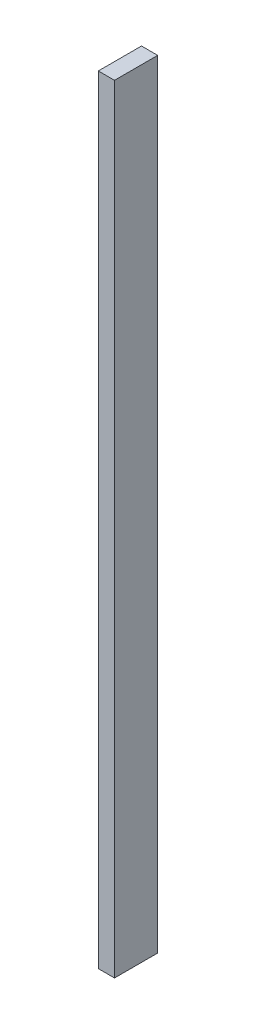
ISO-10303-21;
HEADER;
FILE_DESCRIPTION(('STEP AP214'),'2;1');
FILE_NAME('part.step','',(''),(''),'','','');
FILE_SCHEMA(('AUTOMOTIVE_DESIGN { 1 0 10303 214 1 1 1 1 }'));
ENDSEC;
DATA;
#1=APPLICATION_CONTEXT('core data for automotive mechanical design processes');
#2=APPLICATION_PROTOCOL_DEFINITION('international standard','automotive_design',2000,#1);
#3=PRODUCT_CONTEXT('',#1,'mechanical');
#4=PRODUCT('Part','Part','',(#3));
#5=PRODUCT_RELATED_PRODUCT_CATEGORY('part','',(#4));
#6=PRODUCT_DEFINITION_FORMATION('','',#4);
#7=PRODUCT_DEFINITION_CONTEXT('part definition',#1,'design');
#8=PRODUCT_DEFINITION('design','',#6,#7);
#9=PRODUCT_DEFINITION_SHAPE('','',#8);
#10=(LENGTH_UNIT() NAMED_UNIT(*) SI_UNIT(.MILLI.,.METRE.));
#11=(NAMED_UNIT(*) PLANE_ANGLE_UNIT() SI_UNIT($,.RADIAN.));
#12=(NAMED_UNIT(*) SI_UNIT($,.STERADIAN.) SOLID_ANGLE_UNIT());
#13=UNCERTAINTY_MEASURE_WITH_UNIT(LENGTH_MEASURE(1.E-05),#10,'distance_accuracy_value','');
#14=(GEOMETRIC_REPRESENTATION_CONTEXT(3) GLOBAL_UNCERTAINTY_ASSIGNED_CONTEXT((#13)) GLOBAL_UNIT_ASSIGNED_CONTEXT((#10,
#11,#12)) REPRESENTATION_CONTEXT('',''));
#15=CARTESIAN_POINT('',(0.,0.,0.));
#16=DIRECTION('',(0.,0.,1.));
#17=DIRECTION('',(1.,0.,0.));
#18=AXIS2_PLACEMENT_3D('',#15,#16,#17);
#19=CARTESIAN_POINT('',(0.,0.,12.7));
#20=DIRECTION('',(1.,0.,0.));
#21=DIRECTION('',(0.,0.,-1.));
#22=AXIS2_PLACEMENT_3D('',#19,#20,#21);
#23=PLANE('',#22);
#24=DIRECTION('',(0.,-1.,0.));
#25=VECTOR('',#24,1.);
#26=CARTESIAN_POINT('',(0.,0.,0.));
#27=LINE('',#26,#25);
#28=CARTESIAN_POINT('',(0.,228.6,0.));
#29=VERTEX_POINT('',#28);
#30=CARTESIAN_POINT('',(0.,0.,0.));
#31=VERTEX_POINT('',#30);
#32=EDGE_CURVE('E96',#29,#31,#27,.T.);
#33=ORIENTED_EDGE('',*,*,#32,.T.);
#34=DIRECTION('',(0.,0.,-1.));
#35=VECTOR('',#34,1.);
#36=CARTESIAN_POINT('',(0.,0.,12.7));
#37=LINE('',#36,#35);
#38=CARTESIAN_POINT('',(0.,0.,12.7));
#39=VERTEX_POINT('',#38);
#40=EDGE_CURVE('E11',#39,#31,#37,.T.);
#41=ORIENTED_EDGE('',*,*,#40,.F.);
#42=DIRECTION('',(0.,-1.,0.));
#43=VECTOR('',#42,1.);
#44=CARTESIAN_POINT('',(0.,0.,12.7));
#45=LINE('',#44,#43);
#46=CARTESIAN_POINT('',(0.,228.6,12.7));
#47=VERTEX_POINT('',#46);
#48=EDGE_CURVE('E84',#47,#39,#45,.T.);
#49=ORIENTED_EDGE('',*,*,#48,.F.);
#50=DIRECTION('',(0.,0.,-1.));
#51=VECTOR('',#50,1.);
#52=CARTESIAN_POINT('',(0.,228.6,12.7));
#53=LINE('',#52,#51);
#54=EDGE_CURVE('E92',#47,#29,#53,.T.);
#55=ORIENTED_EDGE('',*,*,#54,.T.);
#56=EDGE_LOOP('',(#33,#41,#49,#55));
#57=FACE_BOUND('',#56,.T.);
#58=ADVANCED_FACE('F33',(#57),#23,.F.);
#59=CARTESIAN_POINT('',(0.,0.,12.7));
#60=DIRECTION('',(0.,1.,0.));
#61=DIRECTION('',(0.,0.,1.));
#62=AXIS2_PLACEMENT_3D('',#59,#60,#61);
#63=PLANE('',#62);
#64=DIRECTION('',(1.,0.,0.));
#65=VECTOR('',#64,1.);
#66=CARTESIAN_POINT('',(0.,0.,0.));
#67=LINE('',#66,#65);
#68=CARTESIAN_POINT('',(4.7625,0.,0.));
#69=VERTEX_POINT('',#68);
#70=EDGE_CURVE('E88',#31,#69,#67,.T.);
#71=ORIENTED_EDGE('',*,*,#70,.T.);
#72=DIRECTION('',(0.,0.,-1.));
#73=VECTOR('',#72,1.);
#74=CARTESIAN_POINT('',(4.7625,0.,12.7));
#75=LINE('',#74,#73);
#76=CARTESIAN_POINT('',(4.7625,0.,12.7));
#77=VERTEX_POINT('',#76);
#78=EDGE_CURVE('E41',#77,#69,#75,.T.);
#79=ORIENTED_EDGE('',*,*,#78,.F.);
#80=DIRECTION('',(1.,0.,0.));
#81=VECTOR('',#80,1.);
#82=CARTESIAN_POINT('',(0.,0.,12.7));
#83=LINE('',#82,#81);
#84=EDGE_CURVE('E79',#39,#77,#83,.T.);
#85=ORIENTED_EDGE('',*,*,#84,.F.);
#86=ORIENTED_EDGE('',*,*,#40,.T.);
#87=EDGE_LOOP('',(#71,#79,#85,#86));
#88=FACE_BOUND('',#87,.T.);
#89=ADVANCED_FACE('F87',(#88),#63,.F.);
#90=CARTESIAN_POINT('',(4.7625,0.,12.7));
#91=DIRECTION('',(-1.,0.,0.));
#92=DIRECTION('',(0.,0.,1.));
#93=AXIS2_PLACEMENT_3D('',#90,#91,#92);
#94=PLANE('',#93);
#95=DIRECTION('',(0.,1.,0.));
#96=VECTOR('',#95,1.);
#97=CARTESIAN_POINT('',(4.7625,0.,0.));
#98=LINE('',#97,#96);
#99=CARTESIAN_POINT('',(4.7625,228.6,0.));
#100=VERTEX_POINT('',#99);
#101=EDGE_CURVE('E66',#69,#100,#98,.T.);
#102=ORIENTED_EDGE('',*,*,#101,.T.);
#103=DIRECTION('',(0.,0.,-1.));
#104=VECTOR('',#103,1.);
#105=CARTESIAN_POINT('',(4.7625,228.6,12.7));
#106=LINE('',#105,#104);
#107=CARTESIAN_POINT('',(4.7625,228.6,12.7));
#108=VERTEX_POINT('',#107);
#109=EDGE_CURVE('E89',#108,#100,#106,.T.);
#110=ORIENTED_EDGE('',*,*,#109,.F.);
#111=DIRECTION('',(0.,1.,0.));
#112=VECTOR('',#111,1.);
#113=CARTESIAN_POINT('',(4.7625,0.,12.7));
#114=LINE('',#113,#112);
#115=EDGE_CURVE('E82',#77,#108,#114,.T.);
#116=ORIENTED_EDGE('',*,*,#115,.F.);
#117=ORIENTED_EDGE('',*,*,#78,.T.);
#118=EDGE_LOOP('',(#102,#110,#116,#117));
#119=FACE_BOUND('',#118,.T.);
#120=ADVANCED_FACE('F90',(#119),#94,.F.);
#121=CARTESIAN_POINT('',(0.,228.6,12.7));
#122=DIRECTION('',(0.,-1.,0.));
#123=DIRECTION('',(0.,0.,-1.));
#124=AXIS2_PLACEMENT_3D('',#121,#122,#123);
#125=PLANE('',#124);
#126=DIRECTION('',(-1.,0.,0.));
#127=VECTOR('',#126,1.);
#128=CARTESIAN_POINT('',(0.,228.6,0.));
#129=LINE('',#128,#127);
#130=EDGE_CURVE('E72',#100,#29,#129,.T.);
#131=ORIENTED_EDGE('',*,*,#130,.T.);
#132=ORIENTED_EDGE('',*,*,#54,.F.);
#133=DIRECTION('',(-1.,0.,0.));
#134=VECTOR('',#133,1.);
#135=CARTESIAN_POINT('',(0.,228.6,12.7));
#136=LINE('',#135,#134);
#137=EDGE_CURVE('E49',#108,#47,#136,.T.);
#138=ORIENTED_EDGE('',*,*,#137,.F.);
#139=ORIENTED_EDGE('',*,*,#109,.T.);
#140=EDGE_LOOP('',(#131,#132,#138,#139));
#141=FACE_BOUND('',#140,.T.);
#142=ADVANCED_FACE('F103',(#141),#125,.F.);
#143=CARTESIAN_POINT('',(0.,0.,12.7));
#144=DIRECTION('',(0.,0.,-1.));
#145=DIRECTION('',(-1.,0.,0.));
#146=AXIS2_PLACEMENT_3D('',#143,#144,#145);
#147=PLANE('',#146);
#148=ORIENTED_EDGE('',*,*,#48,.T.);
#149=ORIENTED_EDGE('',*,*,#84,.T.);
#150=ORIENTED_EDGE('',*,*,#115,.T.);
#151=ORIENTED_EDGE('',*,*,#137,.T.);
#152=EDGE_LOOP('',(#148,#149,#150,#151));
#153=FACE_BOUND('',#152,.T.);
#154=ADVANCED_FACE('F80',(#153),#147,.F.);
#155=CARTESIAN_POINT('',(0.,0.,0.));
#156=DIRECTION('',(0.,0.,-1.));
#157=DIRECTION('',(-1.,0.,0.));
#158=AXIS2_PLACEMENT_3D('',#155,#156,#157);
#159=PLANE('',#158);
#160=ORIENTED_EDGE('',*,*,#32,.F.);
#161=ORIENTED_EDGE('',*,*,#130,.F.);
#162=ORIENTED_EDGE('',*,*,#101,.F.);
#163=ORIENTED_EDGE('',*,*,#70,.F.);
#164=EDGE_LOOP('',(#160,#161,#162,#163));
#165=FACE_BOUND('',#164,.T.);
#166=ADVANCED_FACE('F106',(#165),#159,.T.);
#167=CLOSED_SHELL('',(#58,#89,#120,#142,#154,#166));
#168=MANIFOLD_SOLID_BREP('B2',#167);
#169=ADVANCED_BREP_SHAPE_REPRESENTATION('',(#18,#168),#14);
#170=SHAPE_DEFINITION_REPRESENTATION(#9,#169);
ENDSEC;
END-ISO-10303-21;
